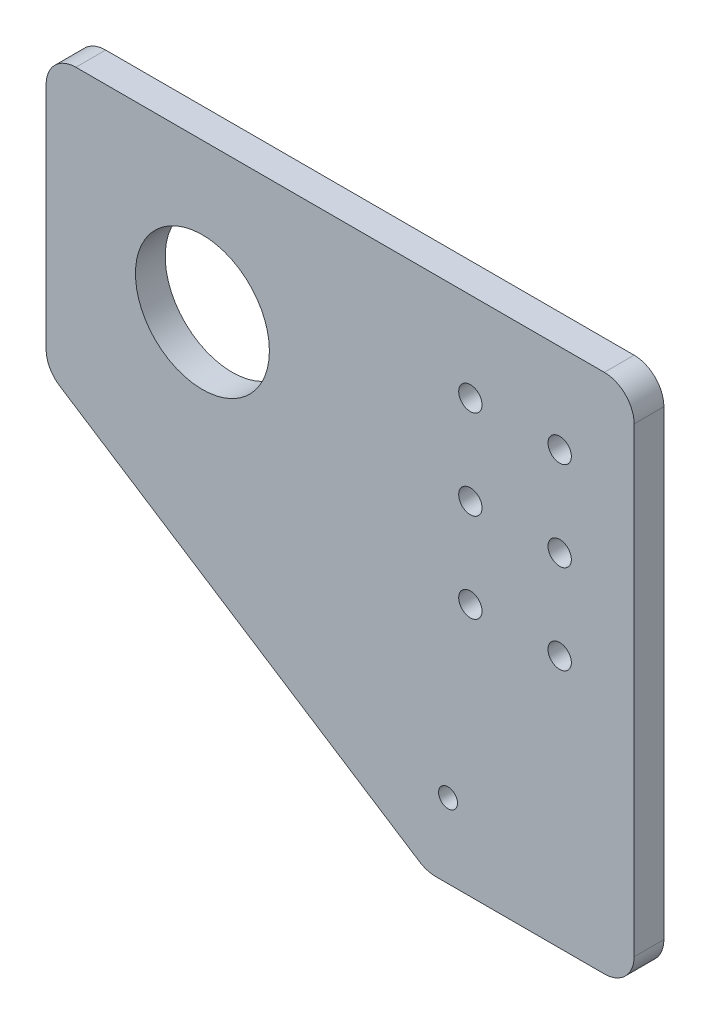
ISO-10303-21;
HEADER;
FILE_DESCRIPTION(('STEP AP214'),'2;1');
FILE_NAME('part.step','',(''),(''),'','','');
FILE_SCHEMA(('AUTOMOTIVE_DESIGN { 1 0 10303 214 1 1 1 1 }'));
ENDSEC;
DATA;
#1=APPLICATION_CONTEXT('core data for automotive mechanical design processes');
#2=APPLICATION_PROTOCOL_DEFINITION('international standard','automotive_design',2000,#1);
#3=PRODUCT_CONTEXT('',#1,'mechanical');
#4=PRODUCT('Part','Part','',(#3));
#5=PRODUCT_RELATED_PRODUCT_CATEGORY('part','',(#4));
#6=PRODUCT_DEFINITION_FORMATION('','',#4);
#7=PRODUCT_DEFINITION_CONTEXT('part definition',#1,'design');
#8=PRODUCT_DEFINITION('design','',#6,#7);
#9=PRODUCT_DEFINITION_SHAPE('','',#8);
#10=(LENGTH_UNIT() NAMED_UNIT(*) SI_UNIT(.MILLI.,.METRE.));
#11=(NAMED_UNIT(*) PLANE_ANGLE_UNIT() SI_UNIT($,.RADIAN.));
#12=(NAMED_UNIT(*) SI_UNIT($,.STERADIAN.) SOLID_ANGLE_UNIT());
#13=UNCERTAINTY_MEASURE_WITH_UNIT(LENGTH_MEASURE(1.E-05),#10,'distance_accuracy_value','');
#14=(GEOMETRIC_REPRESENTATION_CONTEXT(3) GLOBAL_UNCERTAINTY_ASSIGNED_CONTEXT((#13)) GLOBAL_UNIT_ASSIGNED_CONTEXT((#10,
#11,#12)) REPRESENTATION_CONTEXT('',''));
#15=CARTESIAN_POINT('',(0.,0.,0.));
#16=DIRECTION('',(0.,0.,1.));
#17=DIRECTION('',(1.,0.,0.));
#18=AXIS2_PLACEMENT_3D('',#15,#16,#17);
#19=CARTESIAN_POINT('',(0.,0.,6.35));
#20=DIRECTION('',(0.,0.,1.));
#21=DIRECTION('',(1.,0.,0.));
#22=AXIS2_PLACEMENT_3D('',#19,#20,#21);
#23=PLANE('',#22);
#24=CARTESIAN_POINT('',(-41.275,44.45,6.35));
#25=DIRECTION('',(0.,0.,1.));
#26=DIRECTION('',(1.,0.,0.));
#27=AXIS2_PLACEMENT_3D('',#24,#25,#26);
#28=CIRCLE('',#27,14.2875);
#29=CARTESIAN_POINT('',(-26.9875,44.45,6.35));
#30=VERTEX_POINT('',#29);
#31=EDGE_CURVE('E287',#30,#30,#28,.T.);
#32=ORIENTED_EDGE('',*,*,#31,.F.);
#33=EDGE_LOOP('',(#32));
#34=FACE_BOUND('',#33,.T.);
#35=CARTESIAN_POINT('',(34.925,57.15,6.35));
#36=DIRECTION('',(0.,0.,1.));
#37=DIRECTION('',(1.,0.,0.));
#38=AXIS2_PLACEMENT_3D('',#35,#36,#37);
#39=CIRCLE('',#38,2.4892);
#40=CARTESIAN_POINT('',(37.4142,57.15,6.35));
#41=VERTEX_POINT('',#40);
#42=EDGE_CURVE('E271',#41,#41,#39,.T.);
#43=ORIENTED_EDGE('',*,*,#42,.F.);
#44=EDGE_LOOP('',(#43));
#45=FACE_BOUND('',#44,.T.);
#46=CARTESIAN_POINT('',(15.875,38.1,6.35));
#47=DIRECTION('',(0.,0.,1.));
#48=DIRECTION('',(1.,0.,0.));
#49=AXIS2_PLACEMENT_3D('',#46,#47,#48);
#50=CIRCLE('',#49,2.4892);
#51=CARTESIAN_POINT('',(18.3642,38.1,6.35));
#52=VERTEX_POINT('',#51);
#53=EDGE_CURVE('E255',#52,#52,#50,.T.);
#54=ORIENTED_EDGE('',*,*,#53,.F.);
#55=EDGE_LOOP('',(#54));
#56=FACE_BOUND('',#55,.T.);
#57=CARTESIAN_POINT('',(34.925,19.05,6.35));
#58=DIRECTION('',(0.,0.,1.));
#59=DIRECTION('',(1.,0.,0.));
#60=AXIS2_PLACEMENT_3D('',#57,#58,#59);
#61=CIRCLE('',#60,2.4892);
#62=CARTESIAN_POINT('',(37.4142,19.05,6.35));
#63=VERTEX_POINT('',#62);
#64=EDGE_CURVE('E153',#63,#63,#61,.T.);
#65=ORIENTED_EDGE('',*,*,#64,.F.);
#66=EDGE_LOOP('',(#65));
#67=FACE_BOUND('',#66,.T.);
#68=DIRECTION('',(0.840357868330512,-0.542031966894018,0.));
#69=VECTOR('',#68,1.);
#70=CARTESIAN_POINT('',(-74.6125,17.4625,6.35));
#71=LINE('',#70,#69);
#72=CARTESIAN_POINT('',(-71.704402989777,15.5867734770827,6.35));
#73=VERTEX_POINT('',#72);
#74=CARTESIAN_POINT('',(5.03659184830438,-33.9112724638987,6.35));
#75=VERTEX_POINT('',#74);
#76=EDGE_CURVE('E164',#73,#75,#71,.T.);
#77=ORIENTED_EDGE('',*,*,#76,.T.);
#78=CARTESIAN_POINT('',(8.4784948380814,-28.575,6.35));
#79=DIRECTION('',(0.,0.,1.));
#80=DIRECTION('',(1.,0.,0.));
#81=AXIS2_PLACEMENT_3D('',#78,#79,#80);
#82=CIRCLE('',#81,6.35);
#83=CARTESIAN_POINT('',(8.4784948380814,-34.925,6.35));
#84=VERTEX_POINT('',#83);
#85=EDGE_CURVE('E203',#75,#84,#82,.T.);
#86=ORIENTED_EDGE('',*,*,#85,.T.);
#87=DIRECTION('',(1.,0.,0.));
#88=VECTOR('',#87,1.);
#89=CARTESIAN_POINT('',(6.60825913609844,-34.925,6.35));
#90=LINE('',#89,#88);
#91=CARTESIAN_POINT('',(44.45,-34.925,6.35));
#92=VERTEX_POINT('',#91);
#93=EDGE_CURVE('E142',#84,#92,#90,.T.);
#94=ORIENTED_EDGE('',*,*,#93,.T.);
#95=CARTESIAN_POINT('',(44.45,-28.575,6.35));
#96=DIRECTION('',(0.,0.,1.));
#97=DIRECTION('',(1.,0.,0.));
#98=AXIS2_PLACEMENT_3D('',#95,#96,#97);
#99=CIRCLE('',#98,6.35);
#100=CARTESIAN_POINT('',(50.8,-28.575,6.35));
#101=VERTEX_POINT('',#100);
#102=EDGE_CURVE('E197',#92,#101,#99,.T.);
#103=ORIENTED_EDGE('',*,*,#102,.T.);
#104=DIRECTION('',(0.,1.,0.));
#105=VECTOR('',#104,1.);
#106=CARTESIAN_POINT('',(50.8,-34.925,6.35));
#107=LINE('',#106,#105);
#108=CARTESIAN_POINT('',(50.8,69.85,6.35));
#109=VERTEX_POINT('',#108);
#110=EDGE_CURVE('E239',#101,#109,#107,.T.);
#111=ORIENTED_EDGE('',*,*,#110,.T.);
#112=CARTESIAN_POINT('',(44.45,69.85,6.35));
#113=DIRECTION('',(0.,0.,1.));
#114=DIRECTION('',(1.,0.,0.));
#115=AXIS2_PLACEMENT_3D('',#112,#113,#114);
#116=CIRCLE('',#115,6.35);
#117=CARTESIAN_POINT('',(44.45,76.2,6.35));
#118=VERTEX_POINT('',#117);
#119=EDGE_CURVE('E200',#109,#118,#116,.T.);
#120=ORIENTED_EDGE('',*,*,#119,.T.);
#121=DIRECTION('',(-1.,0.,0.));
#122=VECTOR('',#121,1.);
#123=CARTESIAN_POINT('',(50.8,76.2,6.35));
#124=LINE('',#123,#122);
#125=CARTESIAN_POINT('',(-68.2625,76.2,6.35));
#126=VERTEX_POINT('',#125);
#127=EDGE_CURVE('E237',#118,#126,#124,.T.);
#128=ORIENTED_EDGE('',*,*,#127,.T.);
#129=CARTESIAN_POINT('',(-68.2625,69.85,6.35));
#130=DIRECTION('',(0.,0.,1.));
#131=DIRECTION('',(1.,0.,0.));
#132=AXIS2_PLACEMENT_3D('',#129,#130,#131);
#133=CIRCLE('',#132,6.35);
#134=CARTESIAN_POINT('',(-74.6125,69.85,6.35));
#135=VERTEX_POINT('',#134);
#136=EDGE_CURVE('E64',#126,#135,#133,.T.);
#137=ORIENTED_EDGE('',*,*,#136,.T.);
#138=DIRECTION('',(0.,-1.,0.));
#139=VECTOR('',#138,1.);
#140=CARTESIAN_POINT('',(-74.6125,76.2,6.35));
#141=LINE('',#140,#139);
#142=CARTESIAN_POINT('',(-74.6125,20.9230459409815,6.35));
#143=VERTEX_POINT('',#142);
#144=EDGE_CURVE('E224',#135,#143,#141,.T.);
#145=ORIENTED_EDGE('',*,*,#144,.T.);
#146=CARTESIAN_POINT('',(-68.2625,20.9230459409815,6.35));
#147=DIRECTION('',(0.,0.,1.));
#148=DIRECTION('',(1.,0.,0.));
#149=AXIS2_PLACEMENT_3D('',#146,#147,#148);
#150=CIRCLE('',#149,6.35);
#151=EDGE_CURVE('E194',#143,#73,#150,.T.);
#152=ORIENTED_EDGE('',*,*,#151,.T.);
#153=EDGE_LOOP('',(#77,#86,#94,#103,#111,#120,#128,#137,#145,#152));
#154=FACE_BOUND('',#153,.T.);
#155=CARTESIAN_POINT('',(15.875,19.05,6.35));
#156=DIRECTION('',(0.,0.,1.));
#157=DIRECTION('',(1.,0.,0.));
#158=AXIS2_PLACEMENT_3D('',#155,#156,#157);
#159=CIRCLE('',#158,2.4892);
#160=CARTESIAN_POINT('',(18.3642,19.05,6.35));
#161=VERTEX_POINT('',#160);
#162=EDGE_CURVE('E249',#161,#161,#159,.T.);
#163=ORIENTED_EDGE('',*,*,#162,.F.);
#164=EDGE_LOOP('',(#163));
#165=FACE_BOUND('',#164,.T.);
#166=CARTESIAN_POINT('',(34.925,38.1,6.35));
#167=DIRECTION('',(0.,0.,1.));
#168=DIRECTION('',(1.,0.,0.));
#169=AXIS2_PLACEMENT_3D('',#166,#167,#168);
#170=CIRCLE('',#169,2.4892);
#171=CARTESIAN_POINT('',(37.4142,38.1,6.35));
#172=VERTEX_POINT('',#171);
#173=EDGE_CURVE('E263',#172,#172,#170,.T.);
#174=ORIENTED_EDGE('',*,*,#173,.F.);
#175=EDGE_LOOP('',(#174));
#176=FACE_BOUND('',#175,.T.);
#177=CARTESIAN_POINT('',(15.875,57.15,6.35));
#178=DIRECTION('',(0.,0.,1.));
#179=DIRECTION('',(1.,0.,0.));
#180=AXIS2_PLACEMENT_3D('',#177,#178,#179);
#181=CIRCLE('',#180,2.4892);
#182=CARTESIAN_POINT('',(18.3642,57.15,6.35));
#183=VERTEX_POINT('',#182);
#184=EDGE_CURVE('E279',#183,#183,#181,.T.);
#185=ORIENTED_EDGE('',*,*,#184,.F.);
#186=EDGE_LOOP('',(#185));
#187=FACE_BOUND('',#186,.T.);
#188=CARTESIAN_POINT('',(11.1125,-19.05,6.35));
#189=DIRECTION('',(0.,0.,1.));
#190=DIRECTION('',(1.,0.,0.));
#191=AXIS2_PLACEMENT_3D('',#188,#189,#190);
#192=CIRCLE('',#191,2.0193);
#193=CARTESIAN_POINT('',(13.1318,-19.05,6.35));
#194=VERTEX_POINT('',#193);
#195=EDGE_CURVE('E295',#194,#194,#192,.T.);
#196=ORIENTED_EDGE('',*,*,#195,.F.);
#197=EDGE_LOOP('',(#196));
#198=FACE_BOUND('',#197,.T.);
#199=ADVANCED_FACE('F43',(#34,#45,#56,#67,#154,#165,#176,#187,#198),#23,.T.);
#200=CARTESIAN_POINT('',(0.,0.,0.));
#201=DIRECTION('',(0.,0.,1.));
#202=DIRECTION('',(1.,0.,0.));
#203=AXIS2_PLACEMENT_3D('',#200,#201,#202);
#204=PLANE('',#203);
#205=DIRECTION('',(1.,0.,0.));
#206=VECTOR('',#205,1.);
#207=CARTESIAN_POINT('',(6.60825913609844,-34.925,0.));
#208=LINE('',#207,#206);
#209=CARTESIAN_POINT('',(8.4784948380814,-34.925,0.));
#210=VERTEX_POINT('',#209);
#211=CARTESIAN_POINT('',(44.45,-34.925,0.));
#212=VERTEX_POINT('',#211);
#213=EDGE_CURVE('E139',#210,#212,#208,.T.);
#214=ORIENTED_EDGE('',*,*,#213,.F.);
#215=CARTESIAN_POINT('',(8.4784948380814,-28.575,0.));
#216=DIRECTION('',(0.,0.,1.));
#217=DIRECTION('',(1.,0.,0.));
#218=AXIS2_PLACEMENT_3D('',#215,#216,#217);
#219=CIRCLE('',#218,6.35);
#220=CARTESIAN_POINT('',(5.03659184830438,-33.9112724638987,0.));
#221=VERTEX_POINT('',#220);
#222=EDGE_CURVE('E121',#210,#221,#219,.F.);
#223=ORIENTED_EDGE('',*,*,#222,.T.);
#224=DIRECTION('',(0.840357868330512,-0.542031966894018,0.));
#225=VECTOR('',#224,1.);
#226=CARTESIAN_POINT('',(-74.6125,17.4625,0.));
#227=LINE('',#226,#225);
#228=CARTESIAN_POINT('',(-71.704402989777,15.5867734770827,0.));
#229=VERTEX_POINT('',#228);
#230=EDGE_CURVE('E173',#229,#221,#227,.T.);
#231=ORIENTED_EDGE('',*,*,#230,.F.);
#232=CARTESIAN_POINT('',(-68.2625,20.9230459409815,0.));
#233=DIRECTION('',(0.,0.,1.));
#234=DIRECTION('',(1.,0.,0.));
#235=AXIS2_PLACEMENT_3D('',#232,#233,#234);
#236=CIRCLE('',#235,6.35);
#237=CARTESIAN_POINT('',(-74.6125,20.9230459409815,0.));
#238=VERTEX_POINT('',#237);
#239=EDGE_CURVE('E180',#229,#238,#236,.F.);
#240=ORIENTED_EDGE('',*,*,#239,.T.);
#241=DIRECTION('',(0.,-1.,0.));
#242=VECTOR('',#241,1.);
#243=CARTESIAN_POINT('',(-74.6125,76.2,0.));
#244=LINE('',#243,#242);
#245=CARTESIAN_POINT('',(-74.6125,69.85,0.));
#246=VERTEX_POINT('',#245);
#247=EDGE_CURVE('E170',#246,#238,#244,.T.);
#248=ORIENTED_EDGE('',*,*,#247,.F.);
#249=CARTESIAN_POINT('',(-68.2625,69.85,0.));
#250=DIRECTION('',(0.,0.,1.));
#251=DIRECTION('',(1.,0.,0.));
#252=AXIS2_PLACEMENT_3D('',#249,#250,#251);
#253=CIRCLE('',#252,6.35);
#254=CARTESIAN_POINT('',(-68.2625,76.2,0.));
#255=VERTEX_POINT('',#254);
#256=EDGE_CURVE('E144',#246,#255,#253,.F.);
#257=ORIENTED_EDGE('',*,*,#256,.T.);
#258=DIRECTION('',(-1.,0.,0.));
#259=VECTOR('',#258,1.);
#260=CARTESIAN_POINT('',(50.8,76.2,0.));
#261=LINE('',#260,#259);
#262=CARTESIAN_POINT('',(44.45,76.2,0.));
#263=VERTEX_POINT('',#262);
#264=EDGE_CURVE('E158',#263,#255,#261,.T.);
#265=ORIENTED_EDGE('',*,*,#264,.F.);
#266=CARTESIAN_POINT('',(44.45,69.85,0.));
#267=DIRECTION('',(0.,0.,1.));
#268=DIRECTION('',(1.,0.,0.));
#269=AXIS2_PLACEMENT_3D('',#266,#267,#268);
#270=CIRCLE('',#269,6.35);
#271=CARTESIAN_POINT('',(50.8,69.85,0.));
#272=VERTEX_POINT('',#271);
#273=EDGE_CURVE('E133',#263,#272,#270,.F.);
#274=ORIENTED_EDGE('',*,*,#273,.T.);
#275=DIRECTION('',(0.,1.,0.));
#276=VECTOR('',#275,1.);
#277=CARTESIAN_POINT('',(50.8,-34.925,0.));
#278=LINE('',#277,#276);
#279=CARTESIAN_POINT('',(50.8,-28.575,0.));
#280=VERTEX_POINT('',#279);
#281=EDGE_CURVE('E152',#280,#272,#278,.T.);
#282=ORIENTED_EDGE('',*,*,#281,.F.);
#283=CARTESIAN_POINT('',(44.45,-28.575,0.));
#284=DIRECTION('',(0.,0.,1.));
#285=DIRECTION('',(1.,0.,0.));
#286=AXIS2_PLACEMENT_3D('',#283,#284,#285);
#287=CIRCLE('',#286,6.35);
#288=EDGE_CURVE('E150',#280,#212,#287,.F.);
#289=ORIENTED_EDGE('',*,*,#288,.T.);
#290=EDGE_LOOP('',(#214,#223,#231,#240,#248,#257,#265,#274,#282,#289));
#291=FACE_BOUND('',#290,.T.);
#292=CARTESIAN_POINT('',(34.925,19.05,0.));
#293=DIRECTION('',(0.,0.,1.));
#294=DIRECTION('',(1.,0.,0.));
#295=AXIS2_PLACEMENT_3D('',#292,#293,#294);
#296=CIRCLE('',#295,2.4892);
#297=CARTESIAN_POINT('',(37.4142,19.05,0.));
#298=VERTEX_POINT('',#297);
#299=EDGE_CURVE('E161',#298,#298,#296,.T.);
#300=ORIENTED_EDGE('',*,*,#299,.T.);
#301=EDGE_LOOP('',(#300));
#302=FACE_BOUND('',#301,.T.);
#303=CARTESIAN_POINT('',(15.875,19.05,0.));
#304=DIRECTION('',(0.,0.,1.));
#305=DIRECTION('',(1.,0.,0.));
#306=AXIS2_PLACEMENT_3D('',#303,#304,#305);
#307=CIRCLE('',#306,2.4892);
#308=CARTESIAN_POINT('',(18.3642,19.05,0.));
#309=VERTEX_POINT('',#308);
#310=EDGE_CURVE('E251',#309,#309,#307,.T.);
#311=ORIENTED_EDGE('',*,*,#310,.T.);
#312=EDGE_LOOP('',(#311));
#313=FACE_BOUND('',#312,.T.);
#314=CARTESIAN_POINT('',(15.875,38.1,0.));
#315=DIRECTION('',(0.,0.,1.));
#316=DIRECTION('',(1.,0.,0.));
#317=AXIS2_PLACEMENT_3D('',#314,#315,#316);
#318=CIRCLE('',#317,2.4892);
#319=CARTESIAN_POINT('',(18.3642,38.1,0.));
#320=VERTEX_POINT('',#319);
#321=EDGE_CURVE('E259',#320,#320,#318,.T.);
#322=ORIENTED_EDGE('',*,*,#321,.T.);
#323=EDGE_LOOP('',(#322));
#324=FACE_BOUND('',#323,.T.);
#325=CARTESIAN_POINT('',(34.925,38.1,0.));
#326=DIRECTION('',(0.,0.,1.));
#327=DIRECTION('',(1.,0.,0.));
#328=AXIS2_PLACEMENT_3D('',#325,#326,#327);
#329=CIRCLE('',#328,2.4892);
#330=CARTESIAN_POINT('',(37.4142,38.1,0.));
#331=VERTEX_POINT('',#330);
#332=EDGE_CURVE('E267',#331,#331,#329,.T.);
#333=ORIENTED_EDGE('',*,*,#332,.T.);
#334=EDGE_LOOP('',(#333));
#335=FACE_BOUND('',#334,.T.);
#336=CARTESIAN_POINT('',(34.925,57.15,0.));
#337=DIRECTION('',(0.,0.,1.));
#338=DIRECTION('',(1.,0.,0.));
#339=AXIS2_PLACEMENT_3D('',#336,#337,#338);
#340=CIRCLE('',#339,2.4892);
#341=CARTESIAN_POINT('',(37.4142,57.15,0.));
#342=VERTEX_POINT('',#341);
#343=EDGE_CURVE('E275',#342,#342,#340,.T.);
#344=ORIENTED_EDGE('',*,*,#343,.T.);
#345=EDGE_LOOP('',(#344));
#346=FACE_BOUND('',#345,.T.);
#347=CARTESIAN_POINT('',(15.875,57.15,0.));
#348=DIRECTION('',(0.,0.,1.));
#349=DIRECTION('',(1.,0.,0.));
#350=AXIS2_PLACEMENT_3D('',#347,#348,#349);
#351=CIRCLE('',#350,2.4892);
#352=CARTESIAN_POINT('',(18.3642,57.15,0.));
#353=VERTEX_POINT('',#352);
#354=EDGE_CURVE('E283',#353,#353,#351,.T.);
#355=ORIENTED_EDGE('',*,*,#354,.T.);
#356=EDGE_LOOP('',(#355));
#357=FACE_BOUND('',#356,.T.);
#358=CARTESIAN_POINT('',(-41.275,44.45,0.));
#359=DIRECTION('',(0.,0.,1.));
#360=DIRECTION('',(1.,0.,0.));
#361=AXIS2_PLACEMENT_3D('',#358,#359,#360);
#362=CIRCLE('',#361,14.2875);
#363=CARTESIAN_POINT('',(-26.9875,44.45,0.));
#364=VERTEX_POINT('',#363);
#365=EDGE_CURVE('E291',#364,#364,#362,.T.);
#366=ORIENTED_EDGE('',*,*,#365,.T.);
#367=EDGE_LOOP('',(#366));
#368=FACE_BOUND('',#367,.T.);
#369=CARTESIAN_POINT('',(11.1125,-19.05,0.));
#370=DIRECTION('',(0.,0.,1.));
#371=DIRECTION('',(1.,0.,0.));
#372=AXIS2_PLACEMENT_3D('',#369,#370,#371);
#373=CIRCLE('',#372,2.0193);
#374=CARTESIAN_POINT('',(13.1318,-19.05,0.));
#375=VERTEX_POINT('',#374);
#376=EDGE_CURVE('E299',#375,#375,#373,.T.);
#377=ORIENTED_EDGE('',*,*,#376,.T.);
#378=EDGE_LOOP('',(#377));
#379=FACE_BOUND('',#378,.T.);
#380=ADVANCED_FACE('F147',(#291,#302,#313,#324,#335,#346,#357,#368,#379),#204,.F.);
#381=CARTESIAN_POINT('',(6.60825913609844,-34.925,6.35));
#382=DIRECTION('',(0.,1.,0.));
#383=DIRECTION('',(-1.,0.,0.));
#384=AXIS2_PLACEMENT_3D('',#381,#382,#383);
#385=PLANE('',#384);
#386=ORIENTED_EDGE('',*,*,#93,.F.);
#387=DIRECTION('',(0.,0.,-1.));
#388=VECTOR('',#387,1.);
#389=CARTESIAN_POINT('',(8.4784948380814,-34.925,6.35));
#390=LINE('',#389,#388);
#391=EDGE_CURVE('E125',#84,#210,#390,.T.);
#392=ORIENTED_EDGE('',*,*,#391,.T.);
#393=ORIENTED_EDGE('',*,*,#213,.T.);
#394=DIRECTION('',(0.,0.,-1.));
#395=VECTOR('',#394,1.);
#396=CARTESIAN_POINT('',(44.45,-34.925,6.35));
#397=LINE('',#396,#395);
#398=EDGE_CURVE('E145',#212,#92,#397,.F.);
#399=ORIENTED_EDGE('',*,*,#398,.T.);
#400=EDGE_LOOP('',(#386,#392,#393,#399));
#401=FACE_BOUND('',#400,.T.);
#402=ADVANCED_FACE('F138',(#401),#385,.F.);
#403=CARTESIAN_POINT('',(50.8,-34.925,6.35));
#404=DIRECTION('',(-1.,0.,0.));
#405=DIRECTION('',(0.,0.,1.));
#406=AXIS2_PLACEMENT_3D('',#403,#404,#405);
#407=PLANE('',#406);
#408=ORIENTED_EDGE('',*,*,#281,.T.);
#409=DIRECTION('',(0.,0.,-1.));
#410=VECTOR('',#409,1.);
#411=CARTESIAN_POINT('',(50.8,69.85,6.35));
#412=LINE('',#411,#410);
#413=EDGE_CURVE('E217',#272,#109,#412,.F.);
#414=ORIENTED_EDGE('',*,*,#413,.T.);
#415=ORIENTED_EDGE('',*,*,#110,.F.);
#416=DIRECTION('',(0.,0.,-1.));
#417=VECTOR('',#416,1.);
#418=CARTESIAN_POINT('',(50.8,-28.575,6.35));
#419=LINE('',#418,#417);
#420=EDGE_CURVE('E213',#101,#280,#419,.T.);
#421=ORIENTED_EDGE('',*,*,#420,.T.);
#422=EDGE_LOOP('',(#408,#414,#415,#421));
#423=FACE_BOUND('',#422,.T.);
#424=ADVANCED_FACE('F330',(#423),#407,.F.);
#425=CARTESIAN_POINT('',(50.8,76.2,6.35));
#426=DIRECTION('',(0.,-1.,0.));
#427=DIRECTION('',(1.,0.,0.));
#428=AXIS2_PLACEMENT_3D('',#425,#426,#427);
#429=PLANE('',#428);
#430=ORIENTED_EDGE('',*,*,#127,.F.);
#431=DIRECTION('',(0.,0.,-1.));
#432=VECTOR('',#431,1.);
#433=CARTESIAN_POINT('',(44.45,76.2,6.35));
#434=LINE('',#433,#432);
#435=EDGE_CURVE('E209',#118,#263,#434,.T.);
#436=ORIENTED_EDGE('',*,*,#435,.T.);
#437=ORIENTED_EDGE('',*,*,#264,.T.);
#438=DIRECTION('',(0.,0.,-1.));
#439=VECTOR('',#438,1.);
#440=CARTESIAN_POINT('',(-68.2625,76.2,6.35));
#441=LINE('',#440,#439);
#442=EDGE_CURVE('E206',#255,#126,#441,.F.);
#443=ORIENTED_EDGE('',*,*,#442,.T.);
#444=EDGE_LOOP('',(#430,#436,#437,#443));
#445=FACE_BOUND('',#444,.T.);
#446=ADVANCED_FACE('F327',(#445),#429,.F.);
#447=CARTESIAN_POINT('',(-74.6125,76.2,6.35));
#448=DIRECTION('',(1.,0.,0.));
#449=DIRECTION('',(0.,0.,-1.));
#450=AXIS2_PLACEMENT_3D('',#447,#448,#449);
#451=PLANE('',#450);
#452=ORIENTED_EDGE('',*,*,#247,.T.);
#453=DIRECTION('',(0.,0.,-1.));
#454=VECTOR('',#453,1.);
#455=CARTESIAN_POINT('',(-74.6125,20.9230459409815,6.35));
#456=LINE('',#455,#454);
#457=EDGE_CURVE('E11',#238,#143,#456,.F.);
#458=ORIENTED_EDGE('',*,*,#457,.T.);
#459=ORIENTED_EDGE('',*,*,#144,.F.);
#460=DIRECTION('',(0.,0.,-1.));
#461=VECTOR('',#460,1.);
#462=CARTESIAN_POINT('',(-74.6125,69.85,6.35));
#463=LINE('',#462,#461);
#464=EDGE_CURVE('E52',#135,#246,#463,.T.);
#465=ORIENTED_EDGE('',*,*,#464,.T.);
#466=EDGE_LOOP('',(#452,#458,#459,#465));
#467=FACE_BOUND('',#466,.T.);
#468=ADVANCED_FACE('F223',(#467),#451,.F.);
#469=CARTESIAN_POINT('',(-74.6125,17.4625,6.35));
#470=DIRECTION('',(0.542031966894018,0.840357868330512,0.));
#471=DIRECTION('',(-0.840357868330512,0.542031966894018,0.));
#472=AXIS2_PLACEMENT_3D('',#469,#470,#471);
#473=PLANE('',#472);
#474=ORIENTED_EDGE('',*,*,#230,.T.);
#475=DIRECTION('',(0.,0.,-1.));
#476=VECTOR('',#475,1.);
#477=CARTESIAN_POINT('',(5.03659184830439,-33.9112724638988,6.35));
#478=LINE('',#477,#476);
#479=EDGE_CURVE('E126',#221,#75,#478,.F.);
#480=ORIENTED_EDGE('',*,*,#479,.T.);
#481=ORIENTED_EDGE('',*,*,#76,.F.);
#482=DIRECTION('',(0.,0.,-1.));
#483=VECTOR('',#482,1.);
#484=CARTESIAN_POINT('',(-71.704402989777,15.5867734770827,6.35));
#485=LINE('',#484,#483);
#486=EDGE_CURVE('E132',#73,#229,#485,.T.);
#487=ORIENTED_EDGE('',*,*,#486,.T.);
#488=EDGE_LOOP('',(#474,#480,#481,#487));
#489=FACE_BOUND('',#488,.T.);
#490=ADVANCED_FACE('F233',(#489),#473,.F.);
#491=CARTESIAN_POINT('',(34.925,19.05,6.35));
#492=DIRECTION('',(0.,0.,-1.));
#493=DIRECTION('',(-1.,0.,0.));
#494=AXIS2_PLACEMENT_3D('',#491,#492,#493);
#495=CYLINDRICAL_SURFACE('',#494,2.4892);
#496=ORIENTED_EDGE('',*,*,#64,.T.);
#497=EDGE_LOOP('',(#496));
#498=FACE_BOUND('',#497,.T.);
#499=ORIENTED_EDGE('',*,*,#299,.F.);
#500=EDGE_LOOP('',(#499));
#501=FACE_BOUND('',#500,.T.);
#502=ADVANCED_FACE('F320',(#498,#501),#495,.F.);
#503=CARTESIAN_POINT('',(15.875,19.05,6.35));
#504=DIRECTION('',(0.,0.,-1.));
#505=DIRECTION('',(-1.,0.,0.));
#506=AXIS2_PLACEMENT_3D('',#503,#504,#505);
#507=CYLINDRICAL_SURFACE('',#506,2.4892);
#508=ORIENTED_EDGE('',*,*,#162,.T.);
#509=EDGE_LOOP('',(#508));
#510=FACE_BOUND('',#509,.T.);
#511=ORIENTED_EDGE('',*,*,#310,.F.);
#512=EDGE_LOOP('',(#511));
#513=FACE_BOUND('',#512,.T.);
#514=ADVANCED_FACE('F396',(#510,#513),#507,.F.);
#515=CARTESIAN_POINT('',(15.875,38.1,6.35));
#516=DIRECTION('',(0.,0.,-1.));
#517=DIRECTION('',(-1.,0.,0.));
#518=AXIS2_PLACEMENT_3D('',#515,#516,#517);
#519=CYLINDRICAL_SURFACE('',#518,2.4892);
#520=ORIENTED_EDGE('',*,*,#53,.T.);
#521=EDGE_LOOP('',(#520));
#522=FACE_BOUND('',#521,.T.);
#523=ORIENTED_EDGE('',*,*,#321,.F.);
#524=EDGE_LOOP('',(#523));
#525=FACE_BOUND('',#524,.T.);
#526=ADVANCED_FACE('F393',(#522,#525),#519,.F.);
#527=CARTESIAN_POINT('',(34.925,38.1,6.35));
#528=DIRECTION('',(0.,0.,-1.));
#529=DIRECTION('',(-1.,0.,0.));
#530=AXIS2_PLACEMENT_3D('',#527,#528,#529);
#531=CYLINDRICAL_SURFACE('',#530,2.4892);
#532=ORIENTED_EDGE('',*,*,#173,.T.);
#533=EDGE_LOOP('',(#532));
#534=FACE_BOUND('',#533,.T.);
#535=ORIENTED_EDGE('',*,*,#332,.F.);
#536=EDGE_LOOP('',(#535));
#537=FACE_BOUND('',#536,.T.);
#538=ADVANCED_FACE('F389',(#534,#537),#531,.F.);
#539=CARTESIAN_POINT('',(34.925,57.15,6.35));
#540=DIRECTION('',(0.,0.,-1.));
#541=DIRECTION('',(-1.,0.,0.));
#542=AXIS2_PLACEMENT_3D('',#539,#540,#541);
#543=CYLINDRICAL_SURFACE('',#542,2.4892);
#544=ORIENTED_EDGE('',*,*,#42,.T.);
#545=EDGE_LOOP('',(#544));
#546=FACE_BOUND('',#545,.T.);
#547=ORIENTED_EDGE('',*,*,#343,.F.);
#548=EDGE_LOOP('',(#547));
#549=FACE_BOUND('',#548,.T.);
#550=ADVANCED_FACE('F371',(#546,#549),#543,.F.);
#551=CARTESIAN_POINT('',(15.875,57.15,6.35));
#552=DIRECTION('',(0.,0.,-1.));
#553=DIRECTION('',(-1.,0.,0.));
#554=AXIS2_PLACEMENT_3D('',#551,#552,#553);
#555=CYLINDRICAL_SURFACE('',#554,2.4892);
#556=ORIENTED_EDGE('',*,*,#184,.T.);
#557=EDGE_LOOP('',(#556));
#558=FACE_BOUND('',#557,.T.);
#559=ORIENTED_EDGE('',*,*,#354,.F.);
#560=EDGE_LOOP('',(#559));
#561=FACE_BOUND('',#560,.T.);
#562=ADVANCED_FACE('F367',(#558,#561),#555,.F.);
#563=CARTESIAN_POINT('',(-41.275,44.45,6.35));
#564=DIRECTION('',(0.,0.,-1.));
#565=DIRECTION('',(-1.,0.,0.));
#566=AXIS2_PLACEMENT_3D('',#563,#564,#565);
#567=CYLINDRICAL_SURFACE('',#566,14.2875);
#568=ORIENTED_EDGE('',*,*,#31,.T.);
#569=EDGE_LOOP('',(#568));
#570=FACE_BOUND('',#569,.T.);
#571=ORIENTED_EDGE('',*,*,#365,.F.);
#572=EDGE_LOOP('',(#571));
#573=FACE_BOUND('',#572,.T.);
#574=ADVANCED_FACE('F370',(#570,#573),#567,.F.);
#575=CARTESIAN_POINT('',(11.1125,-19.05,6.35));
#576=DIRECTION('',(0.,0.,-1.));
#577=DIRECTION('',(-1.,0.,0.));
#578=AXIS2_PLACEMENT_3D('',#575,#576,#577);
#579=CYLINDRICAL_SURFACE('',#578,2.0193);
#580=ORIENTED_EDGE('',*,*,#195,.T.);
#581=EDGE_LOOP('',(#580));
#582=FACE_BOUND('',#581,.T.);
#583=ORIENTED_EDGE('',*,*,#376,.F.);
#584=EDGE_LOOP('',(#583));
#585=FACE_BOUND('',#584,.T.);
#586=ADVANCED_FACE('F307',(#582,#585),#579,.F.);
#587=CARTESIAN_POINT('',(8.4784948380814,-28.575,6.35));
#588=DIRECTION('',(0.,0.,-1.));
#589=DIRECTION('',(-1.,0.,0.));
#590=AXIS2_PLACEMENT_3D('',#587,#588,#589);
#591=CYLINDRICAL_SURFACE('',#590,6.35);
#592=ORIENTED_EDGE('',*,*,#85,.F.);
#593=ORIENTED_EDGE('',*,*,#479,.F.);
#594=ORIENTED_EDGE('',*,*,#222,.F.);
#595=ORIENTED_EDGE('',*,*,#391,.F.);
#596=EDGE_LOOP('',(#592,#593,#594,#595));
#597=FACE_BOUND('',#596,.T.);
#598=ADVANCED_FACE('F124',(#597),#591,.T.);
#599=CARTESIAN_POINT('',(44.45,69.85,6.35));
#600=DIRECTION('',(0.,0.,-1.));
#601=DIRECTION('',(-1.,0.,0.));
#602=AXIS2_PLACEMENT_3D('',#599,#600,#601);
#603=CYLINDRICAL_SURFACE('',#602,6.35);
#604=ORIENTED_EDGE('',*,*,#119,.F.);
#605=ORIENTED_EDGE('',*,*,#413,.F.);
#606=ORIENTED_EDGE('',*,*,#273,.F.);
#607=ORIENTED_EDGE('',*,*,#435,.F.);
#608=EDGE_LOOP('',(#604,#605,#606,#607));
#609=FACE_BOUND('',#608,.T.);
#610=ADVANCED_FACE('F339',(#609),#603,.T.);
#611=CARTESIAN_POINT('',(44.45,-28.575,6.35));
#612=DIRECTION('',(0.,0.,-1.));
#613=DIRECTION('',(-1.,0.,0.));
#614=AXIS2_PLACEMENT_3D('',#611,#612,#613);
#615=CYLINDRICAL_SURFACE('',#614,6.35);
#616=ORIENTED_EDGE('',*,*,#102,.F.);
#617=ORIENTED_EDGE('',*,*,#398,.F.);
#618=ORIENTED_EDGE('',*,*,#288,.F.);
#619=ORIENTED_EDGE('',*,*,#420,.F.);
#620=EDGE_LOOP('',(#616,#617,#618,#619));
#621=FACE_BOUND('',#620,.T.);
#622=ADVANCED_FACE('F342',(#621),#615,.T.);
#623=CARTESIAN_POINT('',(-68.2625,20.9230459409815,6.35));
#624=DIRECTION('',(0.,0.,-1.));
#625=DIRECTION('',(-1.,0.,0.));
#626=AXIS2_PLACEMENT_3D('',#623,#624,#625);
#627=CYLINDRICAL_SURFACE('',#626,6.35);
#628=ORIENTED_EDGE('',*,*,#151,.F.);
#629=ORIENTED_EDGE('',*,*,#457,.F.);
#630=ORIENTED_EDGE('',*,*,#239,.F.);
#631=ORIENTED_EDGE('',*,*,#486,.F.);
#632=EDGE_LOOP('',(#628,#629,#630,#631));
#633=FACE_BOUND('',#632,.T.);
#634=ADVANCED_FACE('F230',(#633),#627,.T.);
#635=CARTESIAN_POINT('',(-68.2625,69.85,6.35));
#636=DIRECTION('',(0.,0.,-1.));
#637=DIRECTION('',(-1.,0.,0.));
#638=AXIS2_PLACEMENT_3D('',#635,#636,#637);
#639=CYLINDRICAL_SURFACE('',#638,6.35);
#640=ORIENTED_EDGE('',*,*,#136,.F.);
#641=ORIENTED_EDGE('',*,*,#442,.F.);
#642=ORIENTED_EDGE('',*,*,#256,.F.);
#643=ORIENTED_EDGE('',*,*,#464,.F.);
#644=EDGE_LOOP('',(#640,#641,#642,#643));
#645=FACE_BOUND('',#644,.T.);
#646=ADVANCED_FACE('F45',(#645),#639,.T.);
#647=CLOSED_SHELL('',(#199,#380,#402,#424,#446,#468,#490,#502,#514,#526,#538,#550,#562,#574,
#586,#598,#610,#622,#634,#646));
#648=MANIFOLD_SOLID_BREP('B2',#647);
#649=ADVANCED_BREP_SHAPE_REPRESENTATION('',(#18,#648),#14);
#650=SHAPE_DEFINITION_REPRESENTATION(#9,#649);
ENDSEC;
END-ISO-10303-21;
